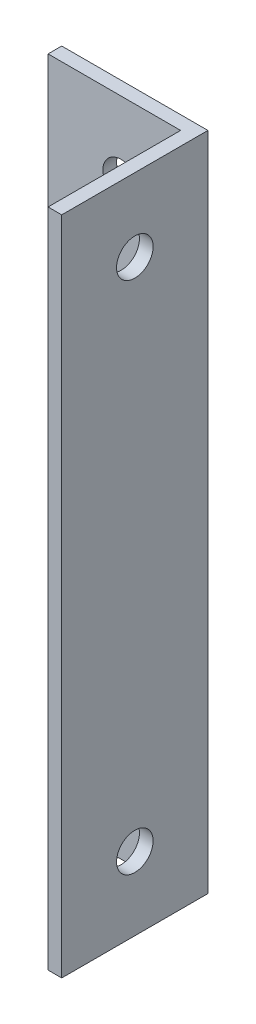
ISO-10303-21;
HEADER;
FILE_DESCRIPTION(('STEP AP214'),'2;1');
FILE_NAME('part.step','',(''),(''),'','','');
FILE_SCHEMA(('AUTOMOTIVE_DESIGN { 1 0 10303 214 1 1 1 1 }'));
ENDSEC;
DATA;
#1=APPLICATION_CONTEXT('core data for automotive mechanical design processes');
#2=APPLICATION_PROTOCOL_DEFINITION('international standard','automotive_design',2000,#1);
#3=PRODUCT_CONTEXT('',#1,'mechanical');
#4=PRODUCT('Part','Part','',(#3));
#5=PRODUCT_RELATED_PRODUCT_CATEGORY('part','',(#4));
#6=PRODUCT_DEFINITION_FORMATION('','',#4);
#7=PRODUCT_DEFINITION_CONTEXT('part definition',#1,'design');
#8=PRODUCT_DEFINITION('design','',#6,#7);
#9=PRODUCT_DEFINITION_SHAPE('','',#8);
#10=(LENGTH_UNIT() NAMED_UNIT(*) SI_UNIT(.MILLI.,.METRE.));
#11=(NAMED_UNIT(*) PLANE_ANGLE_UNIT() SI_UNIT($,.RADIAN.));
#12=(NAMED_UNIT(*) SI_UNIT($,.STERADIAN.) SOLID_ANGLE_UNIT());
#13=UNCERTAINTY_MEASURE_WITH_UNIT(LENGTH_MEASURE(1.E-05),#10,'distance_accuracy_value','');
#14=(GEOMETRIC_REPRESENTATION_CONTEXT(3) GLOBAL_UNCERTAINTY_ASSIGNED_CONTEXT((#13)) GLOBAL_UNIT_ASSIGNED_CONTEXT((#10,
#11,#12)) REPRESENTATION_CONTEXT('',''));
#15=CARTESIAN_POINT('',(0.,0.,0.));
#16=DIRECTION('',(0.,0.,1.));
#17=DIRECTION('',(1.,0.,0.));
#18=AXIS2_PLACEMENT_3D('',#15,#16,#17);
#19=CARTESIAN_POINT('',(-1.778,86.106,0.));
#20=DIRECTION('',(0.,0.,-1.));
#21=DIRECTION('',(-1.,0.,0.));
#22=AXIS2_PLACEMENT_3D('',#19,#20,#21);
#23=PLANE('',#22);
#24=DIRECTION('',(1.,0.,0.));
#25=VECTOR('',#24,1.);
#26=CARTESIAN_POINT('',(-1.778,0.,0.));
#27=LINE('',#26,#25);
#28=CARTESIAN_POINT('',(-1.778,0.,0.));
#29=VERTEX_POINT('',#28);
#30=CARTESIAN_POINT('',(0.,0.,0.));
#31=VERTEX_POINT('',#30);
#32=EDGE_CURVE('E116',#29,#31,#27,.T.);
#33=ORIENTED_EDGE('',*,*,#32,.T.);
#34=DIRECTION('',(0.,-1.,0.));
#35=VECTOR('',#34,1.);
#36=CARTESIAN_POINT('',(0.,86.106,0.));
#37=LINE('',#36,#35);
#38=CARTESIAN_POINT('',(0.,86.106,0.));
#39=VERTEX_POINT('',#38);
#40=EDGE_CURVE('E11',#39,#31,#37,.T.);
#41=ORIENTED_EDGE('',*,*,#40,.F.);
#42=DIRECTION('',(1.,0.,0.));
#43=VECTOR('',#42,1.);
#44=CARTESIAN_POINT('',(-1.778,86.106,0.));
#45=LINE('',#44,#43);
#46=CARTESIAN_POINT('',(-1.778,86.106,0.));
#47=VERTEX_POINT('',#46);
#48=EDGE_CURVE('E127',#47,#39,#45,.T.);
#49=ORIENTED_EDGE('',*,*,#48,.F.);
#50=DIRECTION('',(0.,-1.,0.));
#51=VECTOR('',#50,1.);
#52=CARTESIAN_POINT('',(-1.778,86.106,0.));
#53=LINE('',#52,#51);
#54=EDGE_CURVE('E112',#47,#29,#53,.T.);
#55=ORIENTED_EDGE('',*,*,#54,.T.);
#56=EDGE_LOOP('',(#33,#41,#49,#55));
#57=FACE_BOUND('',#56,.T.);
#58=ADVANCED_FACE('F32',(#57),#23,.F.);
#59=CARTESIAN_POINT('',(0.,86.106,0.));
#60=DIRECTION('',(-1.,0.,0.));
#61=DIRECTION('',(0.,0.,1.));
#62=AXIS2_PLACEMENT_3D('',#59,#60,#61);
#63=PLANE('',#62);
#64=CARTESIAN_POINT('',(0.,9.52499999999998,-9.52500000000001));
#65=DIRECTION('',(-1.,0.,0.));
#66=DIRECTION('',(0.,0.,1.));
#67=AXIS2_PLACEMENT_3D('',#64,#65,#66);
#68=CIRCLE('',#67,2.38125);
#69=CARTESIAN_POINT('',(0.,9.52499999999998,-7.14375000000001));
#70=VERTEX_POINT('',#69);
#71=EDGE_CURVE('E241',#70,#70,#68,.F.);
#72=ORIENTED_EDGE('',*,*,#71,.F.);
#73=EDGE_LOOP('',(#72));
#74=FACE_BOUND('',#73,.T.);
#75=CARTESIAN_POINT('',(0.,76.581,-9.52500000000001));
#76=DIRECTION('',(-1.,0.,0.));
#77=DIRECTION('',(0.,0.,1.));
#78=AXIS2_PLACEMENT_3D('',#75,#76,#77);
#79=CIRCLE('',#78,2.38125);
#80=CARTESIAN_POINT('',(0.,76.581,-7.14375000000001));
#81=VERTEX_POINT('',#80);
#82=EDGE_CURVE('E120',#81,#81,#79,.F.);
#83=ORIENTED_EDGE('',*,*,#82,.F.);
#84=EDGE_LOOP('',(#83));
#85=FACE_BOUND('',#84,.T.);
#86=DIRECTION('',(0.,0.,-1.));
#87=VECTOR('',#86,1.);
#88=CARTESIAN_POINT('',(0.,0.,0.));
#89=LINE('',#88,#87);
#90=CARTESIAN_POINT('',(0.,0.,-19.05));
#91=VERTEX_POINT('',#90);
#92=EDGE_CURVE('E119',#31,#91,#89,.T.);
#93=ORIENTED_EDGE('',*,*,#92,.T.);
#94=DIRECTION('',(0.,-1.,0.));
#95=VECTOR('',#94,1.);
#96=CARTESIAN_POINT('',(0.,86.106,-19.05));
#97=LINE('',#96,#95);
#98=CARTESIAN_POINT('',(0.,86.106,-19.05));
#99=VERTEX_POINT('',#98);
#100=EDGE_CURVE('E40',#99,#91,#97,.T.);
#101=ORIENTED_EDGE('',*,*,#100,.F.);
#102=DIRECTION('',(0.,0.,-1.));
#103=VECTOR('',#102,1.);
#104=CARTESIAN_POINT('',(0.,86.106,0.));
#105=LINE('',#104,#103);
#106=EDGE_CURVE('E85',#39,#99,#105,.T.);
#107=ORIENTED_EDGE('',*,*,#106,.F.);
#108=ORIENTED_EDGE('',*,*,#40,.T.);
#109=EDGE_LOOP('',(#93,#101,#107,#108));
#110=FACE_BOUND('',#109,.T.);
#111=ADVANCED_FACE('F155',(#74,#85,#110),#63,.F.);
#112=CARTESIAN_POINT('',(0.,86.106,-19.05));
#113=DIRECTION('',(0.,0.,1.));
#114=DIRECTION('',(1.,0.,0.));
#115=AXIS2_PLACEMENT_3D('',#112,#113,#114);
#116=PLANE('',#115);
#117=CARTESIAN_POINT('',(-9.52500000000003,76.581,-19.05));
#118=DIRECTION('',(0.,0.,1.));
#119=DIRECTION('',(1.,0.,0.));
#120=AXIS2_PLACEMENT_3D('',#117,#118,#119);
#121=CIRCLE('',#120,2.38125);
#122=CARTESIAN_POINT('',(-7.14375000000003,76.581,-19.05));
#123=VERTEX_POINT('',#122);
#124=EDGE_CURVE('E225',#123,#123,#121,.F.);
#125=ORIENTED_EDGE('',*,*,#124,.F.);
#126=EDGE_LOOP('',(#125));
#127=FACE_BOUND('',#126,.T.);
#128=CARTESIAN_POINT('',(-9.52500000000003,9.52500000000002,-19.05));
#129=DIRECTION('',(0.,0.,1.));
#130=DIRECTION('',(1.,0.,0.));
#131=AXIS2_PLACEMENT_3D('',#128,#129,#130);
#132=CIRCLE('',#131,2.38125);
#133=CARTESIAN_POINT('',(-7.14375000000003,9.52500000000002,-19.05));
#134=VERTEX_POINT('',#133);
#135=EDGE_CURVE('E235',#134,#134,#132,.F.);
#136=ORIENTED_EDGE('',*,*,#135,.F.);
#137=EDGE_LOOP('',(#136));
#138=FACE_BOUND('',#137,.T.);
#139=DIRECTION('',(-1.,0.,0.));
#140=VECTOR('',#139,1.);
#141=CARTESIAN_POINT('',(0.,0.,-19.05));
#142=LINE('',#141,#140);
#143=CARTESIAN_POINT('',(-19.05,0.,-19.05));
#144=VERTEX_POINT('',#143);
#145=EDGE_CURVE('E122',#91,#144,#142,.T.);
#146=ORIENTED_EDGE('',*,*,#145,.T.);
#147=DIRECTION('',(0.,-1.,0.));
#148=VECTOR('',#147,1.);
#149=CARTESIAN_POINT('',(-19.05,86.106,-19.05));
#150=LINE('',#149,#148);
#151=CARTESIAN_POINT('',(-19.05,86.106,-19.05));
#152=VERTEX_POINT('',#151);
#153=EDGE_CURVE('E107',#152,#144,#150,.T.);
#154=ORIENTED_EDGE('',*,*,#153,.F.);
#155=DIRECTION('',(-1.,0.,0.));
#156=VECTOR('',#155,1.);
#157=CARTESIAN_POINT('',(0.,86.106,-19.05));
#158=LINE('',#157,#156);
#159=EDGE_CURVE('E98',#99,#152,#158,.T.);
#160=ORIENTED_EDGE('',*,*,#159,.F.);
#161=ORIENTED_EDGE('',*,*,#100,.T.);
#162=EDGE_LOOP('',(#146,#154,#160,#161));
#163=FACE_BOUND('',#162,.T.);
#164=ADVANCED_FACE('F133',(#127,#138,#163),#116,.F.);
#165=CARTESIAN_POINT('',(-19.05,86.106,-19.05));
#166=DIRECTION('',(1.,0.,0.));
#167=DIRECTION('',(0.,0.,-1.));
#168=AXIS2_PLACEMENT_3D('',#165,#166,#167);
#169=PLANE('',#168);
#170=DIRECTION('',(0.,0.,1.));
#171=VECTOR('',#170,1.);
#172=CARTESIAN_POINT('',(-19.05,0.,-19.05));
#173=LINE('',#172,#171);
#174=CARTESIAN_POINT('',(-19.05,0.,-17.272));
#175=VERTEX_POINT('',#174);
#176=EDGE_CURVE('E106',#144,#175,#173,.T.);
#177=ORIENTED_EDGE('',*,*,#176,.T.);
#178=DIRECTION('',(0.,-1.,0.));
#179=VECTOR('',#178,1.);
#180=CARTESIAN_POINT('',(-19.05,86.106,-17.272));
#181=LINE('',#180,#179);
#182=CARTESIAN_POINT('',(-19.05,86.106,-17.272));
#183=VERTEX_POINT('',#182);
#184=EDGE_CURVE('E103',#183,#175,#181,.T.);
#185=ORIENTED_EDGE('',*,*,#184,.F.);
#186=DIRECTION('',(0.,0.,1.));
#187=VECTOR('',#186,1.);
#188=CARTESIAN_POINT('',(-19.05,86.106,-19.05));
#189=LINE('',#188,#187);
#190=EDGE_CURVE('E92',#152,#183,#189,.T.);
#191=ORIENTED_EDGE('',*,*,#190,.F.);
#192=ORIENTED_EDGE('',*,*,#153,.T.);
#193=EDGE_LOOP('',(#177,#185,#191,#192));
#194=FACE_BOUND('',#193,.T.);
#195=ADVANCED_FACE('F104',(#194),#169,.F.);
#196=CARTESIAN_POINT('',(-19.05,86.106,-17.272));
#197=DIRECTION('',(0.,0.,-1.));
#198=DIRECTION('',(-1.,0.,0.));
#199=AXIS2_PLACEMENT_3D('',#196,#197,#198);
#200=PLANE('',#199);
#201=CARTESIAN_POINT('',(-9.52500000000003,76.581,-17.272));
#202=DIRECTION('',(0.,0.,1.));
#203=DIRECTION('',(1.,0.,0.));
#204=AXIS2_PLACEMENT_3D('',#201,#202,#203);
#205=CIRCLE('',#204,2.38125);
#206=CARTESIAN_POINT('',(-7.14375000000003,76.581,-17.272));
#207=VERTEX_POINT('',#206);
#208=EDGE_CURVE('E228',#207,#207,#205,.T.);
#209=ORIENTED_EDGE('',*,*,#208,.F.);
#210=EDGE_LOOP('',(#209));
#211=FACE_BOUND('',#210,.T.);
#212=CARTESIAN_POINT('',(-9.52500000000003,9.52500000000002,-17.272));
#213=DIRECTION('',(0.,0.,1.));
#214=DIRECTION('',(1.,0.,0.));
#215=AXIS2_PLACEMENT_3D('',#212,#213,#214);
#216=CIRCLE('',#215,2.38125);
#217=CARTESIAN_POINT('',(-7.14375000000003,9.52500000000002,-17.272));
#218=VERTEX_POINT('',#217);
#219=EDGE_CURVE('E230',#218,#218,#216,.T.);
#220=ORIENTED_EDGE('',*,*,#219,.F.);
#221=EDGE_LOOP('',(#220));
#222=FACE_BOUND('',#221,.T.);
#223=DIRECTION('',(1.,0.,0.));
#224=VECTOR('',#223,1.);
#225=CARTESIAN_POINT('',(-19.05,0.,-17.272));
#226=LINE('',#225,#224);
#227=CARTESIAN_POINT('',(-1.77800000000004,0.,-17.272));
#228=VERTEX_POINT('',#227);
#229=EDGE_CURVE('E71',#175,#228,#226,.T.);
#230=ORIENTED_EDGE('',*,*,#229,.T.);
#231=DIRECTION('',(0.,-1.,0.));
#232=VECTOR('',#231,1.);
#233=CARTESIAN_POINT('',(-1.77800000000004,86.106,-17.272));
#234=LINE('',#233,#232);
#235=CARTESIAN_POINT('',(-1.77800000000004,86.106,-17.272));
#236=VERTEX_POINT('',#235);
#237=EDGE_CURVE('E108',#236,#228,#234,.T.);
#238=ORIENTED_EDGE('',*,*,#237,.F.);
#239=DIRECTION('',(1.,0.,0.));
#240=VECTOR('',#239,1.);
#241=CARTESIAN_POINT('',(-19.05,86.106,-17.272));
#242=LINE('',#241,#240);
#243=EDGE_CURVE('E96',#183,#236,#242,.T.);
#244=ORIENTED_EDGE('',*,*,#243,.F.);
#245=ORIENTED_EDGE('',*,*,#184,.T.);
#246=EDGE_LOOP('',(#230,#238,#244,#245));
#247=FACE_BOUND('',#246,.T.);
#248=ADVANCED_FACE('F110',(#211,#222,#247),#200,.F.);
#249=CARTESIAN_POINT('',(-1.77800000000004,86.106,-17.272));
#250=DIRECTION('',(1.,0.,0.));
#251=DIRECTION('',(0.,0.,-1.));
#252=AXIS2_PLACEMENT_3D('',#249,#250,#251);
#253=PLANE('',#252);
#254=CARTESIAN_POINT('',(-1.77800000000004,9.52499999999998,-9.52500000000001));
#255=DIRECTION('',(-1.,0.,0.));
#256=DIRECTION('',(0.,0.,1.));
#257=AXIS2_PLACEMENT_3D('',#254,#255,#256);
#258=CIRCLE('',#257,2.38125);
#259=CARTESIAN_POINT('',(-1.77800000000004,9.52499999999998,-7.14375000000001));
#260=VERTEX_POINT('',#259);
#261=EDGE_CURVE('E238',#260,#260,#258,.T.);
#262=ORIENTED_EDGE('',*,*,#261,.F.);
#263=EDGE_LOOP('',(#262));
#264=FACE_BOUND('',#263,.T.);
#265=CARTESIAN_POINT('',(-1.77800000000004,76.581,-9.52500000000001));
#266=DIRECTION('',(-1.,0.,0.));
#267=DIRECTION('',(0.,0.,1.));
#268=AXIS2_PLACEMENT_3D('',#265,#266,#267);
#269=CIRCLE('',#268,2.38125);
#270=CARTESIAN_POINT('',(-1.77800000000004,76.581,-7.14375000000001));
#271=VERTEX_POINT('',#270);
#272=EDGE_CURVE('E244',#271,#271,#269,.T.);
#273=ORIENTED_EDGE('',*,*,#272,.F.);
#274=EDGE_LOOP('',(#273));
#275=FACE_BOUND('',#274,.T.);
#276=DIRECTION('',(0.,0.,1.));
#277=VECTOR('',#276,1.);
#278=CARTESIAN_POINT('',(-1.77800000000004,0.,-17.272));
#279=LINE('',#278,#277);
#280=EDGE_CURVE('E77',#228,#29,#279,.T.);
#281=ORIENTED_EDGE('',*,*,#280,.T.);
#282=ORIENTED_EDGE('',*,*,#54,.F.);
#283=DIRECTION('',(0.,0.,1.));
#284=VECTOR('',#283,1.);
#285=CARTESIAN_POINT('',(-1.77800000000004,86.106,-17.272));
#286=LINE('',#285,#284);
#287=EDGE_CURVE('E48',#236,#47,#286,.T.);
#288=ORIENTED_EDGE('',*,*,#287,.F.);
#289=ORIENTED_EDGE('',*,*,#237,.T.);
#290=EDGE_LOOP('',(#281,#282,#288,#289));
#291=FACE_BOUND('',#290,.T.);
#292=ADVANCED_FACE('F140',(#264,#275,#291),#253,.F.);
#293=CARTESIAN_POINT('',(0.,86.106,0.));
#294=DIRECTION('',(0.,1.,0.));
#295=DIRECTION('',(0.,0.,1.));
#296=AXIS2_PLACEMENT_3D('',#293,#294,#295);
#297=PLANE('',#296);
#298=ORIENTED_EDGE('',*,*,#48,.T.);
#299=ORIENTED_EDGE('',*,*,#106,.T.);
#300=ORIENTED_EDGE('',*,*,#159,.T.);
#301=ORIENTED_EDGE('',*,*,#190,.T.);
#302=ORIENTED_EDGE('',*,*,#243,.T.);
#303=ORIENTED_EDGE('',*,*,#287,.T.);
#304=EDGE_LOOP('',(#298,#299,#300,#301,#302,#303));
#305=FACE_BOUND('',#304,.T.);
#306=ADVANCED_FACE('F94',(#305),#297,.T.);
#307=CARTESIAN_POINT('',(0.,0.,0.));
#308=DIRECTION('',(0.,1.,0.));
#309=DIRECTION('',(0.,0.,1.));
#310=AXIS2_PLACEMENT_3D('',#307,#308,#309);
#311=PLANE('',#310);
#312=ORIENTED_EDGE('',*,*,#32,.F.);
#313=ORIENTED_EDGE('',*,*,#280,.F.);
#314=ORIENTED_EDGE('',*,*,#229,.F.);
#315=ORIENTED_EDGE('',*,*,#176,.F.);
#316=ORIENTED_EDGE('',*,*,#145,.F.);
#317=ORIENTED_EDGE('',*,*,#92,.F.);
#318=EDGE_LOOP('',(#312,#313,#314,#315,#316,#317));
#319=FACE_BOUND('',#318,.T.);
#320=ADVANCED_FACE('F136',(#319),#311,.F.);
#321=CARTESIAN_POINT('',(6.73519209080183,76.581,-9.52500000000001));
#322=DIRECTION('',(-1.,0.,0.));
#323=DIRECTION('',(0.,0.,1.));
#324=AXIS2_PLACEMENT_3D('',#321,#322,#323);
#325=CYLINDRICAL_SURFACE('',#324,2.38125);
#326=ORIENTED_EDGE('',*,*,#82,.T.);
#327=EDGE_LOOP('',(#326));
#328=FACE_BOUND('',#327,.T.);
#329=ORIENTED_EDGE('',*,*,#272,.T.);
#330=EDGE_LOOP('',(#329));
#331=FACE_BOUND('',#330,.T.);
#332=ADVANCED_FACE('F190',(#328,#331),#325,.F.);
#333=CARTESIAN_POINT('',(6.73519209080183,9.52499999999997,-9.52500000000001));
#334=DIRECTION('',(-1.,0.,0.));
#335=DIRECTION('',(0.,0.,1.));
#336=AXIS2_PLACEMENT_3D('',#333,#334,#335);
#337=CYLINDRICAL_SURFACE('',#336,2.38125);
#338=ORIENTED_EDGE('',*,*,#71,.T.);
#339=EDGE_LOOP('',(#338));
#340=FACE_BOUND('',#339,.T.);
#341=ORIENTED_EDGE('',*,*,#261,.T.);
#342=EDGE_LOOP('',(#341));
#343=FACE_BOUND('',#342,.T.);
#344=ADVANCED_FACE('F196',(#340,#343),#337,.F.);
#345=CARTESIAN_POINT('',(-9.52500000000007,9.52500000000004,-25.7851920908019));
#346=DIRECTION('',(0.,0.,1.));
#347=DIRECTION('',(1.,0.,0.));
#348=AXIS2_PLACEMENT_3D('',#345,#346,#347);
#349=CYLINDRICAL_SURFACE('',#348,2.38125);
#350=ORIENTED_EDGE('',*,*,#135,.T.);
#351=EDGE_LOOP('',(#350));
#352=FACE_BOUND('',#351,.T.);
#353=ORIENTED_EDGE('',*,*,#219,.T.);
#354=EDGE_LOOP('',(#353));
#355=FACE_BOUND('',#354,.T.);
#356=ADVANCED_FACE('F204',(#352,#355),#349,.F.);
#357=CARTESIAN_POINT('',(-9.52500000000007,76.581,-25.7851920908019));
#358=DIRECTION('',(0.,0.,1.));
#359=DIRECTION('',(1.,0.,0.));
#360=AXIS2_PLACEMENT_3D('',#357,#358,#359);
#361=CYLINDRICAL_SURFACE('',#360,2.38125);
#362=ORIENTED_EDGE('',*,*,#124,.T.);
#363=EDGE_LOOP('',(#362));
#364=FACE_BOUND('',#363,.T.);
#365=ORIENTED_EDGE('',*,*,#208,.T.);
#366=EDGE_LOOP('',(#365));
#367=FACE_BOUND('',#366,.T.);
#368=ADVANCED_FACE('F212',(#364,#367),#361,.F.);
#369=CLOSED_SHELL('',(#58,#111,#164,#195,#248,#292,#306,#320,#332,#344,#356,#368));
#370=MANIFOLD_SOLID_BREP('B2',#369);
#371=ADVANCED_BREP_SHAPE_REPRESENTATION('',(#18,#370),#14);
#372=SHAPE_DEFINITION_REPRESENTATION(#9,#371);
ENDSEC;
END-ISO-10303-21;
